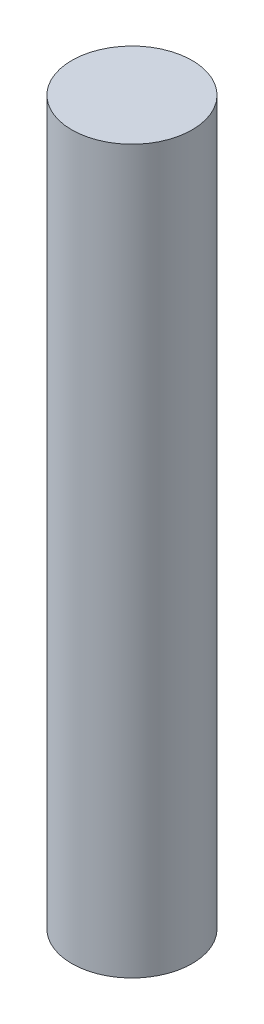
ISO-10303-21;
HEADER;
FILE_DESCRIPTION(('STEP AP214'),'2;1');
FILE_NAME('part.step','',(''),(''),'','','');
FILE_SCHEMA(('AUTOMOTIVE_DESIGN { 1 0 10303 214 1 1 1 1 }'));
ENDSEC;
DATA;
#1=APPLICATION_CONTEXT('core data for automotive mechanical design processes');
#2=APPLICATION_PROTOCOL_DEFINITION('international standard','automotive_design',2000,#1);
#3=PRODUCT_CONTEXT('',#1,'mechanical');
#4=PRODUCT('Part','Part','',(#3));
#5=PRODUCT_RELATED_PRODUCT_CATEGORY('part','',(#4));
#6=PRODUCT_DEFINITION_FORMATION('','',#4);
#7=PRODUCT_DEFINITION_CONTEXT('part definition',#1,'design');
#8=PRODUCT_DEFINITION('design','',#6,#7);
#9=PRODUCT_DEFINITION_SHAPE('','',#8);
#10=(LENGTH_UNIT() NAMED_UNIT(*) SI_UNIT(.MILLI.,.METRE.));
#11=(NAMED_UNIT(*) PLANE_ANGLE_UNIT() SI_UNIT($,.RADIAN.));
#12=(NAMED_UNIT(*) SI_UNIT($,.STERADIAN.) SOLID_ANGLE_UNIT());
#13=UNCERTAINTY_MEASURE_WITH_UNIT(LENGTH_MEASURE(1.E-05),#10,'distance_accuracy_value','');
#14=(GEOMETRIC_REPRESENTATION_CONTEXT(3) GLOBAL_UNCERTAINTY_ASSIGNED_CONTEXT((#13)) GLOBAL_UNIT_ASSIGNED_CONTEXT((#10,
#11,#12)) REPRESENTATION_CONTEXT('',''));
#15=CARTESIAN_POINT('',(0.,0.,0.));
#16=DIRECTION('',(0.,0.,1.));
#17=DIRECTION('',(1.,0.,0.));
#18=AXIS2_PLACEMENT_3D('',#15,#16,#17);
#19=CARTESIAN_POINT('',(0.,300.,0.));
#20=DIRECTION('',(0.,-1.,0.));
#21=DIRECTION('',(0.,0.,-1.));
#22=AXIS2_PLACEMENT_3D('',#19,#20,#21);
#23=CYLINDRICAL_SURFACE('',#22,25.);
#24=CARTESIAN_POINT('',(0.,300.,0.));
#25=DIRECTION('',(0.,1.,0.));
#26=DIRECTION('',(0.,0.,1.));
#27=AXIS2_PLACEMENT_3D('',#24,#25,#26);
#28=CIRCLE('',#27,25.);
#29=CARTESIAN_POINT('',(0.,300.,25.));
#30=VERTEX_POINT('',#29);
#31=EDGE_CURVE('E10',#30,#30,#28,.T.);
#32=ORIENTED_EDGE('',*,*,#31,.F.);
#33=EDGE_LOOP('',(#32));
#34=FACE_BOUND('',#33,.T.);
#35=CARTESIAN_POINT('',(0.,0.,0.));
#36=DIRECTION('',(0.,1.,0.));
#37=DIRECTION('',(0.,0.,1.));
#38=AXIS2_PLACEMENT_3D('',#35,#36,#37);
#39=CIRCLE('',#38,25.);
#40=CARTESIAN_POINT('',(0.,0.,25.));
#41=VERTEX_POINT('',#40);
#42=EDGE_CURVE('E36',#41,#41,#39,.T.);
#43=ORIENTED_EDGE('',*,*,#42,.T.);
#44=EDGE_LOOP('',(#43));
#45=FACE_BOUND('',#44,.T.);
#46=ADVANCED_FACE('F33',(#34,#45),#23,.T.);
#47=CARTESIAN_POINT('',(0.,300.,0.));
#48=DIRECTION('',(0.,1.,0.));
#49=DIRECTION('',(0.,0.,1.));
#50=AXIS2_PLACEMENT_3D('',#47,#48,#49);
#51=PLANE('',#50);
#52=ORIENTED_EDGE('',*,*,#31,.T.);
#53=EDGE_LOOP('',(#52));
#54=FACE_BOUND('',#53,.T.);
#55=ADVANCED_FACE('F48',(#54),#51,.T.);
#56=CARTESIAN_POINT('',(0.,0.,0.));
#57=DIRECTION('',(0.,1.,0.));
#58=DIRECTION('',(0.,0.,1.));
#59=AXIS2_PLACEMENT_3D('',#56,#57,#58);
#60=PLANE('',#59);
#61=ORIENTED_EDGE('',*,*,#42,.F.);
#62=EDGE_LOOP('',(#61));
#63=FACE_BOUND('',#62,.T.);
#64=ADVANCED_FACE('F46',(#63),#60,.F.);
#65=CLOSED_SHELL('',(#46,#55,#64));
#66=MANIFOLD_SOLID_BREP('B2',#65);
#67=ADVANCED_BREP_SHAPE_REPRESENTATION('',(#18,#66),#14);
#68=SHAPE_DEFINITION_REPRESENTATION(#9,#67);
ENDSEC;
END-ISO-10303-21;
